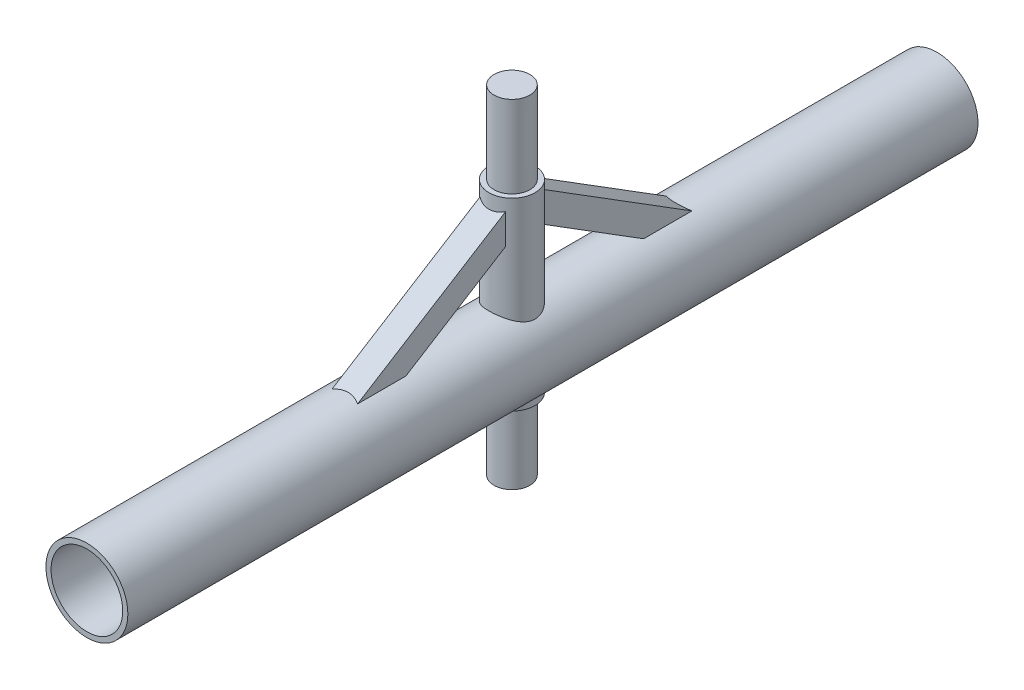
ISO-10303-21;
HEADER;
FILE_DESCRIPTION(('STEP AP214'),'2;1');
FILE_NAME('part.step','',(''),(''),'','','');
FILE_SCHEMA(('AUTOMOTIVE_DESIGN { 1 0 10303 214 1 1 1 1 }'));
ENDSEC;
DATA;
#1=APPLICATION_CONTEXT('core data for automotive mechanical design processes');
#2=APPLICATION_PROTOCOL_DEFINITION('international standard','automotive_design',2000,#1);
#3=PRODUCT_CONTEXT('',#1,'mechanical');
#4=PRODUCT('Part','Part','',(#3));
#5=PRODUCT_RELATED_PRODUCT_CATEGORY('part','',(#4));
#6=PRODUCT_DEFINITION_FORMATION('','',#4);
#7=PRODUCT_DEFINITION_CONTEXT('part definition',#1,'design');
#8=PRODUCT_DEFINITION('design','',#6,#7);
#9=PRODUCT_DEFINITION_SHAPE('','',#8);
#10=(LENGTH_UNIT() NAMED_UNIT(*) SI_UNIT(.MILLI.,.METRE.));
#11=(NAMED_UNIT(*) PLANE_ANGLE_UNIT() SI_UNIT($,.RADIAN.));
#12=(NAMED_UNIT(*) SI_UNIT($,.STERADIAN.) SOLID_ANGLE_UNIT());
#13=UNCERTAINTY_MEASURE_WITH_UNIT(LENGTH_MEASURE(1.E-05),#10,'distance_accuracy_value','');
#14=(GEOMETRIC_REPRESENTATION_CONTEXT(3) GLOBAL_UNCERTAINTY_ASSIGNED_CONTEXT((#13)) GLOBAL_UNIT_ASSIGNED_CONTEXT((#10,
#11,#12)) REPRESENTATION_CONTEXT('',''));
#15=CARTESIAN_POINT('',(0.,0.,0.));
#16=DIRECTION('',(0.,0.,1.));
#17=DIRECTION('',(1.,0.,0.));
#18=AXIS2_PLACEMENT_3D('',#15,#16,#17);
#19=CARTESIAN_POINT('',(12.5,140.,0.));
#20=DIRECTION('',(0.,-0.847998304005088,0.52999894000318));
#21=DIRECTION('',(0.,0.52999894000318,0.847998304005088));
#22=AXIS2_PLACEMENT_3D('',#19,#20,#21);
#23=PLANE('',#22);
#24=DIRECTION('',(0.,-0.52999894000318,-0.847998304005088));
#25=VECTOR('',#24,1.);
#26=CARTESIAN_POINT('',(12.5,140.,0.));
#27=LINE('',#26,#25);
#28=CARTESIAN_POINT('',(12.5,140.,0.));
#29=VERTEX_POINT('',#28);
#30=CARTESIAN_POINT('',(12.5,32.6917420765551,-171.693212677512));
#31=VERTEX_POINT('',#30);
#32=EDGE_CURVE('E115',#29,#31,#27,.T.);
#33=ORIENTED_EDGE('',*,*,#32,.T.);
#34=CARTESIAN_POINT('',(0.,0.,-224.));
#35=DIRECTION('',(0.,-0.847998304005088,0.52999894000318));
#36=DIRECTION('',(0.,-0.52999894000318,-0.847998304005088));
#37=AXIS2_PLACEMENT_3D('',#34,#35,#36);
#38=ELLIPSE('',#37,66.0378679243962,35.);
#39=CARTESIAN_POINT('',(-12.5,32.6917420765551,-171.693212677512));
#40=VERTEX_POINT('',#39);
#41=EDGE_CURVE('E125',#31,#40,#38,.T.);
#42=ORIENTED_EDGE('',*,*,#41,.T.);
#43=DIRECTION('',(0.,-0.52999894000318,-0.847998304005088));
#44=VECTOR('',#43,1.);
#45=CARTESIAN_POINT('',(-12.5,140.,0.));
#46=LINE('',#45,#44);
#47=CARTESIAN_POINT('',(-12.5,140.,0.));
#48=VERTEX_POINT('',#47);
#49=EDGE_CURVE('E111',#48,#40,#46,.T.);
#50=ORIENTED_EDGE('',*,*,#49,.F.);
#51=DIRECTION('',(-1.,0.,0.));
#52=VECTOR('',#51,1.);
#53=CARTESIAN_POINT('',(12.5,140.,0.));
#54=LINE('',#53,#52);
#55=EDGE_CURVE('E118',#29,#48,#54,.T.);
#56=ORIENTED_EDGE('',*,*,#55,.F.);
#57=EDGE_LOOP('',(#33,#42,#50,#56));
#58=FACE_BOUND('',#57,.T.);
#59=ADVANCED_FACE('F72',(#58),#23,.F.);
#60=CARTESIAN_POINT('',(12.5,118.800042399873,13.2499735000795));
#61=DIRECTION('',(0.,-0.847998304005088,0.52999894000318));
#62=DIRECTION('',(0.,0.52999894000318,0.847998304005088));
#63=AXIS2_PLACEMENT_3D('',#60,#61,#62);
#64=PLANE('',#63);
#65=CARTESIAN_POINT('',(0.,0.,-176.830094339717));
#66=DIRECTION('',(0.,-0.847998304005088,0.52999894000318));
#67=DIRECTION('',(0.,-0.52999894000318,-0.847998304005088));
#68=AXIS2_PLACEMENT_3D('',#65,#66,#67);
#69=ELLIPSE('',#68,66.0378679243962,35.);
#70=CARTESIAN_POINT('',(12.5,32.6917420765551,-124.523307017229));
#71=VERTEX_POINT('',#70);
#72=CARTESIAN_POINT('',(-12.5,32.6917420765551,-124.523307017229));
#73=VERTEX_POINT('',#72);
#74=EDGE_CURVE('E85',#71,#73,#69,.T.);
#75=ORIENTED_EDGE('',*,*,#74,.F.);
#76=DIRECTION('',(0.,-0.52999894000318,-0.847998304005088));
#77=VECTOR('',#76,1.);
#78=CARTESIAN_POINT('',(12.5,118.800042399873,13.2499735000795));
#79=LINE('',#78,#77);
#80=CARTESIAN_POINT('',(12.5,118.800042399873,13.2499735000795));
#81=VERTEX_POINT('',#80);
#82=EDGE_CURVE('E137',#81,#71,#79,.T.);
#83=ORIENTED_EDGE('',*,*,#82,.F.);
#84=DIRECTION('',(-1.,0.,0.));
#85=VECTOR('',#84,1.);
#86=CARTESIAN_POINT('',(12.5,118.800042399873,13.2499735000795));
#87=LINE('',#86,#85);
#88=CARTESIAN_POINT('',(-12.5,118.800042399873,13.2499735000795));
#89=VERTEX_POINT('',#88);
#90=EDGE_CURVE('E79',#81,#89,#87,.T.);
#91=ORIENTED_EDGE('',*,*,#90,.T.);
#92=DIRECTION('',(0.,-0.52999894000318,-0.847998304005088));
#93=VECTOR('',#92,1.);
#94=CARTESIAN_POINT('',(-12.5,118.800042399873,13.2499735000795));
#95=LINE('',#94,#93);
#96=EDGE_CURVE('E113',#89,#73,#95,.T.);
#97=ORIENTED_EDGE('',*,*,#96,.T.);
#98=EDGE_LOOP('',(#75,#83,#91,#97));
#99=FACE_BOUND('',#98,.T.);
#100=ADVANCED_FACE('F135',(#99),#64,.T.);
#101=CARTESIAN_POINT('',(12.5,140.,0.));
#102=DIRECTION('',(0.,0.52999894000318,0.847998304005088));
#103=DIRECTION('',(0.,0.847998304005088,-0.52999894000318));
#104=AXIS2_PLACEMENT_3D('',#101,#102,#103);
#105=PLANE('',#104);
#106=DIRECTION('',(0.,-0.847998304005088,0.52999894000318));
#107=VECTOR('',#106,1.);
#108=CARTESIAN_POINT('',(-12.5,140.,0.));
#109=LINE('',#108,#107);
#110=EDGE_CURVE('E107',#48,#89,#109,.T.);
#111=ORIENTED_EDGE('',*,*,#110,.T.);
#112=ORIENTED_EDGE('',*,*,#90,.F.);
#113=DIRECTION('',(0.,-0.847998304005088,0.52999894000318));
#114=VECTOR('',#113,1.);
#115=CARTESIAN_POINT('',(12.5,140.,0.));
#116=LINE('',#115,#114);
#117=EDGE_CURVE('E94',#29,#81,#116,.T.);
#118=ORIENTED_EDGE('',*,*,#117,.F.);
#119=ORIENTED_EDGE('',*,*,#55,.T.);
#120=EDGE_LOOP('',(#111,#112,#118,#119));
#121=FACE_BOUND('',#120,.T.);
#122=ADVANCED_FACE('F119',(#121),#105,.T.);
#123=CARTESIAN_POINT('',(12.5,0.,0.));
#124=DIRECTION('',(-1.,0.,0.));
#125=DIRECTION('',(0.,0.,-1.));
#126=AXIS2_PLACEMENT_3D('',#123,#124,#125);
#127=PLANE('',#126);
#128=ORIENTED_EDGE('',*,*,#82,.T.);
#129=DIRECTION('',(0.,0.,-1.));
#130=VECTOR('',#129,1.);
#131=CARTESIAN_POINT('',(12.5,32.691742076555,431.));
#132=LINE('',#131,#130);
#133=EDGE_CURVE('E126',#71,#31,#132,.T.);
#134=ORIENTED_EDGE('',*,*,#133,.T.);
#135=ORIENTED_EDGE('',*,*,#32,.F.);
#136=ORIENTED_EDGE('',*,*,#117,.T.);
#137=EDGE_LOOP('',(#128,#134,#135,#136));
#138=FACE_BOUND('',#137,.T.);
#139=ADVANCED_FACE('F143',(#138),#127,.F.);
#140=CARTESIAN_POINT('',(-12.5,0.,0.));
#141=DIRECTION('',(-1.,0.,0.));
#142=DIRECTION('',(0.,0.,-1.));
#143=AXIS2_PLACEMENT_3D('',#140,#141,#142);
#144=PLANE('',#143);
#145=DIRECTION('',(0.,0.,-1.));
#146=VECTOR('',#145,1.);
#147=CARTESIAN_POINT('',(-12.5,32.691742076555,431.));
#148=LINE('',#147,#146);
#149=EDGE_CURVE('E13',#73,#40,#148,.T.);
#150=ORIENTED_EDGE('',*,*,#149,.F.);
#151=ORIENTED_EDGE('',*,*,#96,.F.);
#152=ORIENTED_EDGE('',*,*,#110,.F.);
#153=ORIENTED_EDGE('',*,*,#49,.T.);
#154=EDGE_LOOP('',(#150,#151,#152,#153));
#155=FACE_BOUND('',#154,.T.);
#156=ADVANCED_FACE('F108',(#155),#144,.T.);
#157=CARTESIAN_POINT('',(0.,0.,431.));
#158=DIRECTION('',(0.,0.,-1.));
#159=DIRECTION('',(-1.,0.,0.));
#160=AXIS2_PLACEMENT_3D('',#157,#158,#159);
#161=CYLINDRICAL_SURFACE('',#160,35.);
#162=ORIENTED_EDGE('',*,*,#74,.T.);
#163=ORIENTED_EDGE('',*,*,#149,.T.);
#164=ORIENTED_EDGE('',*,*,#41,.F.);
#165=ORIENTED_EDGE('',*,*,#133,.F.);
#166=EDGE_LOOP('',(#162,#163,#164,#165));
#167=FACE_BOUND('',#166,.T.);
#168=ADVANCED_FACE('F144',(#167),#161,.F.);
#169=CLOSED_SHELL('',(#59,#100,#122,#139,#156,#168));
#170=MANIFOLD_SOLID_BREP('B2',#169);
#171=CARTESIAN_POINT('',(12.5,140.,0.));
#172=DIRECTION('',(0.,-0.847998304005088,-0.52999894000318));
#173=DIRECTION('',(0.,0.52999894000318,-0.847998304005088));
#174=AXIS2_PLACEMENT_3D('',#171,#172,#173);
#175=PLANE('',#174);
#176=DIRECTION('',(0.,-0.52999894000318,0.847998304005088));
#177=VECTOR('',#176,1.);
#178=CARTESIAN_POINT('',(-12.5,140.,0.));
#179=LINE('',#178,#177);
#180=CARTESIAN_POINT('',(-12.5,140.,0.));
#181=VERTEX_POINT('',#180);
#182=CARTESIAN_POINT('',(-12.5,32.6917420765549,171.693212677512));
#183=VERTEX_POINT('',#182);
#184=EDGE_CURVE('E243',#181,#183,#179,.T.);
#185=ORIENTED_EDGE('',*,*,#184,.T.);
#186=CARTESIAN_POINT('',(0.,0.,224.));
#187=DIRECTION('',(0.,-0.847998304005088,-0.52999894000318));
#188=DIRECTION('',(0.,0.52999894000318,-0.847998304005088));
#189=AXIS2_PLACEMENT_3D('',#186,#187,#188);
#190=ELLIPSE('',#189,66.0378679243962,35.);
#191=CARTESIAN_POINT('',(12.5,32.6917420765551,171.693212677512));
#192=VERTEX_POINT('',#191);
#193=EDGE_CURVE('E221',#183,#192,#190,.T.);
#194=ORIENTED_EDGE('',*,*,#193,.T.);
#195=DIRECTION('',(0.,-0.52999894000318,0.847998304005088));
#196=VECTOR('',#195,1.);
#197=CARTESIAN_POINT('',(12.5,140.,0.));
#198=LINE('',#197,#196);
#199=CARTESIAN_POINT('',(12.5,140.,0.));
#200=VERTEX_POINT('',#199);
#201=EDGE_CURVE('E245',#200,#192,#198,.T.);
#202=ORIENTED_EDGE('',*,*,#201,.F.);
#203=DIRECTION('',(-1.,0.,0.));
#204=VECTOR('',#203,1.);
#205=CARTESIAN_POINT('',(12.5,140.,0.));
#206=LINE('',#205,#204);
#207=EDGE_CURVE('E230',#200,#181,#206,.T.);
#208=ORIENTED_EDGE('',*,*,#207,.T.);
#209=EDGE_LOOP('',(#185,#194,#202,#208));
#210=FACE_BOUND('',#209,.T.);
#211=ADVANCED_FACE('F208',(#210),#175,.F.);
#212=CARTESIAN_POINT('',(12.5,118.800042399873,-13.2499735000795));
#213=DIRECTION('',(0.,-0.847998304005088,-0.52999894000318));
#214=DIRECTION('',(0.,0.52999894000318,-0.847998304005088));
#215=AXIS2_PLACEMENT_3D('',#212,#213,#214);
#216=PLANE('',#215);
#217=CARTESIAN_POINT('',(0.,0.,176.830094339717));
#218=DIRECTION('',(0.,-0.847998304005088,-0.52999894000318));
#219=DIRECTION('',(0.,0.52999894000318,-0.847998304005088));
#220=AXIS2_PLACEMENT_3D('',#217,#218,#219);
#221=ELLIPSE('',#220,66.0378679243962,35.);
#222=CARTESIAN_POINT('',(-12.5,32.6917420765549,124.523307017229));
#223=VERTEX_POINT('',#222);
#224=CARTESIAN_POINT('',(12.5,32.6917420765551,124.523307017229));
#225=VERTEX_POINT('',#224);
#226=EDGE_CURVE('E270',#223,#225,#221,.T.);
#227=ORIENTED_EDGE('',*,*,#226,.F.);
#228=DIRECTION('',(0.,-0.52999894000318,0.847998304005088));
#229=VECTOR('',#228,1.);
#230=CARTESIAN_POINT('',(-12.5,118.800042399873,-13.2499735000795));
#231=LINE('',#230,#229);
#232=CARTESIAN_POINT('',(-12.5,118.800042399873,-13.2499735000795));
#233=VERTEX_POINT('',#232);
#234=EDGE_CURVE('E254',#233,#223,#231,.T.);
#235=ORIENTED_EDGE('',*,*,#234,.F.);
#236=DIRECTION('',(-1.,0.,0.));
#237=VECTOR('',#236,1.);
#238=CARTESIAN_POINT('',(12.5,118.800042399873,-13.2499735000795));
#239=LINE('',#238,#237);
#240=CARTESIAN_POINT('',(12.5,118.800042399873,-13.2499735000795));
#241=VERTEX_POINT('',#240);
#242=EDGE_CURVE('E215',#241,#233,#239,.T.);
#243=ORIENTED_EDGE('',*,*,#242,.F.);
#244=DIRECTION('',(0.,-0.52999894000318,0.847998304005088));
#245=VECTOR('',#244,1.);
#246=CARTESIAN_POINT('',(12.5,118.800042399873,-13.2499735000795));
#247=LINE('',#246,#245);
#248=EDGE_CURVE('E260',#241,#225,#247,.T.);
#249=ORIENTED_EDGE('',*,*,#248,.T.);
#250=EDGE_LOOP('',(#227,#235,#243,#249));
#251=FACE_BOUND('',#250,.T.);
#252=ADVANCED_FACE('F281',(#251),#216,.T.);
#253=CARTESIAN_POINT('',(12.5,140.,0.));
#254=DIRECTION('',(0.,0.52999894000318,-0.847998304005088));
#255=DIRECTION('',(0.,0.847998304005088,0.52999894000318));
#256=AXIS2_PLACEMENT_3D('',#253,#254,#255);
#257=PLANE('',#256);
#258=DIRECTION('',(0.,-0.847998304005088,-0.52999894000318));
#259=VECTOR('',#258,1.);
#260=CARTESIAN_POINT('',(-12.5,140.,0.));
#261=LINE('',#260,#259);
#262=EDGE_CURVE('E253',#181,#233,#261,.T.);
#263=ORIENTED_EDGE('',*,*,#262,.F.);
#264=ORIENTED_EDGE('',*,*,#207,.F.);
#265=DIRECTION('',(0.,-0.847998304005088,-0.52999894000318));
#266=VECTOR('',#265,1.);
#267=CARTESIAN_POINT('',(12.5,140.,0.));
#268=LINE('',#267,#266);
#269=EDGE_CURVE('E247',#200,#241,#268,.T.);
#270=ORIENTED_EDGE('',*,*,#269,.T.);
#271=ORIENTED_EDGE('',*,*,#242,.T.);
#272=EDGE_LOOP('',(#263,#264,#270,#271));
#273=FACE_BOUND('',#272,.T.);
#274=ADVANCED_FACE('F257',(#273),#257,.T.);
#275=CARTESIAN_POINT('',(12.5,0.,0.));
#276=DIRECTION('',(-1.,0.,0.));
#277=DIRECTION('',(0.,0.,1.));
#278=AXIS2_PLACEMENT_3D('',#275,#276,#277);
#279=PLANE('',#278);
#280=ORIENTED_EDGE('',*,*,#201,.T.);
#281=DIRECTION('',(0.,0.,-1.));
#282=VECTOR('',#281,1.);
#283=CARTESIAN_POINT('',(12.5,32.691742076555,431.));
#284=LINE('',#283,#282);
#285=EDGE_CURVE('E255',#192,#225,#284,.T.);
#286=ORIENTED_EDGE('',*,*,#285,.T.);
#287=ORIENTED_EDGE('',*,*,#248,.F.);
#288=ORIENTED_EDGE('',*,*,#269,.F.);
#289=EDGE_LOOP('',(#280,#286,#287,#288));
#290=FACE_BOUND('',#289,.T.);
#291=ADVANCED_FACE('F280',(#290),#279,.F.);
#292=CARTESIAN_POINT('',(-12.5,0.,0.));
#293=DIRECTION('',(-1.,0.,0.));
#294=DIRECTION('',(0.,0.,1.));
#295=AXIS2_PLACEMENT_3D('',#292,#293,#294);
#296=PLANE('',#295);
#297=DIRECTION('',(0.,0.,-1.));
#298=VECTOR('',#297,1.);
#299=CARTESIAN_POINT('',(-12.5,32.691742076555,431.));
#300=LINE('',#299,#298);
#301=EDGE_CURVE('E70',#183,#223,#300,.T.);
#302=ORIENTED_EDGE('',*,*,#301,.F.);
#303=ORIENTED_EDGE('',*,*,#184,.F.);
#304=ORIENTED_EDGE('',*,*,#262,.T.);
#305=ORIENTED_EDGE('',*,*,#234,.T.);
#306=EDGE_LOOP('',(#302,#303,#304,#305));
#307=FACE_BOUND('',#306,.T.);
#308=ADVANCED_FACE('F251',(#307),#296,.T.);
#309=CARTESIAN_POINT('',(0.,0.,431.));
#310=DIRECTION('',(0.,0.,-1.));
#311=DIRECTION('',(-1.,0.,0.));
#312=AXIS2_PLACEMENT_3D('',#309,#310,#311);
#313=CYLINDRICAL_SURFACE('',#312,35.);
#314=ORIENTED_EDGE('',*,*,#193,.F.);
#315=ORIENTED_EDGE('',*,*,#301,.T.);
#316=ORIENTED_EDGE('',*,*,#226,.T.);
#317=ORIENTED_EDGE('',*,*,#285,.F.);
#318=EDGE_LOOP('',(#314,#315,#316,#317));
#319=FACE_BOUND('',#318,.T.);
#320=ADVANCED_FACE('F274',(#319),#313,.F.);
#321=CLOSED_SHELL('',(#211,#252,#274,#291,#308,#320));
#322=MANIFOLD_SOLID_BREP('B7',#321);
#323=CARTESIAN_POINT('',(0.,0.,415.));
#324=DIRECTION('',(0.,0.,1.));
#325=DIRECTION('',(1.,0.,0.));
#326=AXIS2_PLACEMENT_3D('',#323,#324,#325);
#327=PLANE('',#326);
#328=CARTESIAN_POINT('',(0.,0.,415.));
#329=DIRECTION('',(0.,0.,1.));
#330=DIRECTION('',(1.,0.,0.));
#331=AXIS2_PLACEMENT_3D('',#328,#329,#330);
#332=CIRCLE('',#331,40.);
#333=CARTESIAN_POINT('',(40.,0.,415.));
#334=VERTEX_POINT('',#333);
#335=EDGE_CURVE('E206',#334,#334,#332,.T.);
#336=ORIENTED_EDGE('',*,*,#335,.T.);
#337=EDGE_LOOP('',(#336));
#338=FACE_BOUND('',#337,.T.);
#339=CARTESIAN_POINT('',(0.,0.,415.));
#340=DIRECTION('',(0.,0.,1.));
#341=DIRECTION('',(1.,0.,0.));
#342=AXIS2_PLACEMENT_3D('',#339,#340,#341);
#343=CIRCLE('',#342,35.);
#344=CARTESIAN_POINT('',(35.,0.,415.));
#345=VERTEX_POINT('',#344);
#346=EDGE_CURVE('E372',#345,#345,#343,.T.);
#347=ORIENTED_EDGE('',*,*,#346,.F.);
#348=EDGE_LOOP('',(#347));
#349=FACE_BOUND('',#348,.T.);
#350=ADVANCED_FACE('F335',(#338,#349),#327,.T.);
#351=CARTESIAN_POINT('',(0.,0.,-415.));
#352=DIRECTION('',(0.,0.,1.));
#353=DIRECTION('',(1.,0.,0.));
#354=AXIS2_PLACEMENT_3D('',#351,#352,#353);
#355=PLANE('',#354);
#356=CARTESIAN_POINT('',(0.,0.,-415.));
#357=DIRECTION('',(0.,0.,1.));
#358=DIRECTION('',(1.,0.,0.));
#359=AXIS2_PLACEMENT_3D('',#356,#357,#358);
#360=CIRCLE('',#359,40.);
#361=CARTESIAN_POINT('',(40.,0.,-415.));
#362=VERTEX_POINT('',#361);
#363=EDGE_CURVE('E340',#362,#362,#360,.T.);
#364=ORIENTED_EDGE('',*,*,#363,.F.);
#365=EDGE_LOOP('',(#364));
#366=FACE_BOUND('',#365,.T.);
#367=CARTESIAN_POINT('',(0.,0.,-415.));
#368=DIRECTION('',(0.,0.,1.));
#369=DIRECTION('',(1.,0.,0.));
#370=AXIS2_PLACEMENT_3D('',#367,#368,#369);
#371=CIRCLE('',#370,35.);
#372=CARTESIAN_POINT('',(35.,0.,-415.));
#373=VERTEX_POINT('',#372);
#374=EDGE_CURVE('E370',#373,#373,#371,.T.);
#375=ORIENTED_EDGE('',*,*,#374,.T.);
#376=EDGE_LOOP('',(#375));
#377=FACE_BOUND('',#376,.T.);
#378=ADVANCED_FACE('F395',(#366,#377),#355,.F.);
#379=CARTESIAN_POINT('',(0.,0.,415.));
#380=DIRECTION('',(0.,0.,-1.));
#381=DIRECTION('',(-1.,0.,0.));
#382=AXIS2_PLACEMENT_3D('',#379,#380,#381);
#383=CYLINDRICAL_SURFACE('',#382,40.);
#384=CARTESIAN_POINT('',(0.,40.,22.5));
#385=CARTESIAN_POINT('',(-0.582842708004399,40.0000028747453,22.5000032616442));
#386=CARTESIAN_POINT('',(-1.16564520092616,39.9872350148417,22.4773295988438));
#387=CARTESIAN_POINT('',(-2.32659981126642,39.9365050427239,22.3869571422411));
#388=CARTESIAN_POINT('',(-2.90475234131067,39.8985451915144,22.3192623891223));
#389=CARTESIAN_POINT('',(-4.05204204985224,39.798399617706,22.1397413317104));
#390=CARTESIAN_POINT('',(-4.62117868017059,39.7362124278905,22.027912354627));
#391=CARTESIAN_POINT('',(-5.74635607353228,39.5891569260193,21.7615181410175));
#392=CARTESIAN_POINT('',(-6.30239641185826,39.5042878794819,21.6069515205597));
#393=CARTESIAN_POINT('',(-7.39567880800235,39.3142552389115,21.257517911812));
#394=CARTESIAN_POINT('',(-7.93298402016726,39.2091696308424,21.0628055861302));
#395=CARTESIAN_POINT('',(-8.98792861881766,38.9808726729156,20.6347089136993));
#396=CARTESIAN_POINT('',(-9.5055682007765,38.8576615032827,20.4013249514642));
#397=CARTESIAN_POINT('',(-10.5186834156493,38.5957396316075,19.8979225259563));
#398=CARTESIAN_POINT('',(-11.0141561118093,38.4570268843219,19.6278992275626));
#399=CARTESIAN_POINT('',(-11.9807434448446,38.1669549646015,19.0532925118838));
#400=CARTESIAN_POINT('',(-12.4518569374973,38.0155951989715,18.7487074732761));
#401=CARTESIAN_POINT('',(-13.4002873733342,37.6921837900244,18.0842695197957));
#402=CARTESIAN_POINT('',(-13.8756936721032,37.5194257363197,17.7220327712706));
#403=CARTESIAN_POINT('',(-14.794656096327,37.1666576002672,16.9624168302446));
#404=CARTESIAN_POINT('',(-15.2382109936693,36.9866472387053,16.5650362840012));
#405=CARTESIAN_POINT('',(-16.092205275423,36.623168795607,15.7367441117663));
#406=CARTESIAN_POINT('',(-16.5026118832935,36.4396975077673,15.3058001058968));
#407=CARTESIAN_POINT('',(-17.2882037348819,36.073616992836,14.4125575180027));
#408=CARTESIAN_POINT('',(-17.6633872440418,35.8910078086188,13.9502573937779));
#409=CARTESIAN_POINT('',(-18.4141973362719,35.5121408242704,12.9460578826098));
#410=CARTESIAN_POINT('',(-18.7857586740667,35.3164554271611,12.4008919729551));
#411=CARTESIAN_POINT('',(-19.4813208398476,34.9375880544138,11.2767478054505));
#412=CARTESIAN_POINT('',(-19.8053152339639,34.754407771998,10.6977649883278));
#413=CARTESIAN_POINT('',(-20.4024712706217,34.4072427610336,9.50950858111642));
#414=CARTESIAN_POINT('',(-20.6756932603201,34.2432353311436,8.90027205623779));
#415=CARTESIAN_POINT('',(-21.1685574077533,33.940770755214,7.65444588842905));
#416=CARTESIAN_POINT('',(-21.3882164148005,33.802305577692,7.01786492154682));
#417=CARTESIAN_POINT('',(-21.7296056132037,33.5835671119156,5.86136117498093));
#418=CARTESIAN_POINT('',(-21.8622369046886,33.4971831758974,5.34578929180124));
#419=CARTESIAN_POINT('',(-22.0910629081592,33.3467203273417,4.30343013769548));
#420=CARTESIAN_POINT('',(-22.1872628603243,33.2826382070824,3.77664449124675));
#421=CARTESIAN_POINT('',(-22.3419453368724,33.1790019869129,2.71562919059567));
#422=CARTESIAN_POINT('',(-22.4004606838209,33.1394265433182,2.18140642948987));
#423=CARTESIAN_POINT('',(-22.4790931833452,33.0861398549894,1.10882831644106));
#424=CARTESIAN_POINT('',(-22.4992095468679,33.0724291417446,0.570472879804749));
#425=CARTESIAN_POINT('',(-22.5007456435318,33.0713841204579,-0.506964754478015));
#426=CARTESIAN_POINT('',(-22.4821189548791,33.0840814544473,-1.04604704963445));
#427=CARTESIAN_POINT('',(-22.4063500474121,33.1354424845277,-2.12023636008031));
#428=CARTESIAN_POINT('',(-22.3492076894862,33.1741062744047,-2.65534336100462));
#429=CARTESIAN_POINT('',(-22.1971680751838,33.2760284597723,-3.71807066599507));
#430=CARTESIAN_POINT('',(-22.1022495749259,33.3393006936698,-4.24568658415381));
#431=CARTESIAN_POINT('',(-21.8758721303611,33.4882745376466,-5.28976365573693));
#432=CARTESIAN_POINT('',(-21.7444123023207,33.5739766901793,-5.80622453905684));
#433=CARTESIAN_POINT('',(-21.4466995150655,33.7649263321605,-6.82420937216611));
#434=CARTESIAN_POINT('',(-21.2805106914385,33.8701377531723,-7.3257589358119));
#435=CARTESIAN_POINT('',(-20.9146901170169,34.0972443409954,-8.31281608907455));
#436=CARTESIAN_POINT('',(-20.7150447391058,34.2191463022773,-8.79831704510393));
#437=CARTESIAN_POINT('',(-20.2839059870141,34.4764579192127,-9.75123926652381));
#438=CARTESIAN_POINT('',(-20.052411789127,34.6118679242,-10.2186600639062));
#439=CARTESIAN_POINT('',(-19.5590265398915,34.8930524304818,-11.1339499291878));
#440=CARTESIAN_POINT('',(-19.2971321676898,35.0388280634215,-11.5818168536939));
#441=CARTESIAN_POINT('',(-18.7012500107675,35.3609257042423,-12.5248095074577));
#442=CARTESIAN_POINT('',(-18.362385601054,35.5384708435214,-13.0164423914936));
#443=CARTESIAN_POINT('',(-17.6477151227213,35.89872287142,-13.970084726176));
#444=CARTESIAN_POINT('',(-17.2719060582923,36.0814301777777,-14.4320917694615));
#445=CARTESIAN_POINT('',(-16.4847539342782,36.447790872857,-15.3250570573738));
#446=CARTESIAN_POINT('',(-16.0733843834685,36.6314448693689,-15.7559917082119));
#447=CARTESIAN_POINT('',(-15.2169892280442,36.995401587998,-16.5845790853625));
#448=CARTESIAN_POINT('',(-14.7719621880343,37.175704166778,-16.9822303907103));
#449=CARTESIAN_POINT('',(-13.8006050868513,37.5478608254627,-17.7828737659942));
#450=CARTESIAN_POINT('',(-13.2706695120362,37.7388889748402,-18.1818915017718));
#451=CARTESIAN_POINT('',(-12.174159121949,38.106748314231,-18.9336132878125));
#452=CARTESIAN_POINT('',(-11.6075811559579,38.2835782804665,-19.2863133474979));
#453=CARTESIAN_POINT('',(-10.4412055867492,38.6179886952564,-19.9418780897963));
#454=CARTESIAN_POINT('',(-9.84142412334843,38.7755783789183,-20.2447667057292));
#455=CARTESIAN_POINT('',(-8.61231098762186,39.0669528010283,-20.7974025899126));
#456=CARTESIAN_POINT('',(-7.98298295790614,39.2007404641885,-21.0471563879301));
#457=CARTESIAN_POINT('',(-6.74463104802714,39.4319466125262,-21.4745986621966));
#458=CARTESIAN_POINT('',(-6.13728234023035,39.5312586885121,-21.6561148759567));
#459=CARTESIAN_POINT('',(-4.9057934380301,39.7028910031878,-21.9678519010774));
#460=CARTESIAN_POINT('',(-4.28165388410641,39.7752122698701,-22.0980746660497));
#461=CARTESIAN_POINT('',(-3.02240505507508,39.8906569794945,-22.3051991237483));
#462=CARTESIAN_POINT('',(-2.38730464262449,39.9338029738052,-22.3821420008974));
#463=CARTESIAN_POINT('',(-1.11154805783345,39.9896480891537,-22.4816299070194));
#464=CARTESIAN_POINT('',(-0.470892470868689,40.0023503799851,-22.5041805992999));
#465=CARTESIAN_POINT('',(0.734891137641707,39.9972486929139,-22.4951068807173));
#466=CARTESIAN_POINT('',(1.30009043291871,39.9828384065366,-22.4695093120004));
#467=CARTESIAN_POINT('',(2.42582295046457,39.930349300341,-22.3759761851093));
#468=CARTESIAN_POINT('',(2.98635660741586,39.8922727110246,-22.3080446168284));
#469=CARTESIAN_POINT('',(4.09875709596571,39.7933669230592,-22.1306903318865));
#470=CARTESIAN_POINT('',(4.65062392829828,39.7325377263372,-22.0212676187395));
#471=CARTESIAN_POINT('',(5.74200838210678,39.5895474307202,-21.7622132120761));
#472=CARTESIAN_POINT('',(6.28152561431637,39.5073856604152,-21.6125802529988));
#473=CARTESIAN_POINT('',(7.341408120721,39.3241796438909,-21.2758294792172));
#474=CARTESIAN_POINT('',(7.86187568783914,39.2232625933147,-21.0889635911317));
#475=CARTESIAN_POINT('',(8.88454995875952,39.0043362964773,-20.6789335077446));
#476=CARTESIAN_POINT('',(9.38675696995999,38.8863273381081,-20.455769923825));
#477=CARTESIAN_POINT('',(10.370624284151,38.6355785086386,-19.9749842864997));
#478=CARTESIAN_POINT('',(10.8522819537049,38.5028367573066,-19.7173578340033));
#479=CARTESIAN_POINT('',(11.7930454249405,38.225183860513,-19.1695184602571));
#480=CARTESIAN_POINT('',(12.2521490314041,38.0802715341771,-18.8793023760107));
#481=CARTESIAN_POINT('',(13.1924543768361,37.7654569920647,-18.2363992046701));
#482=CARTESIAN_POINT('',(13.6710168824329,37.594521235013,-17.8803549654531));
#483=CARTESIAN_POINT('',(14.5967230630132,37.2448726587364,-17.1329978929119));
#484=CARTESIAN_POINT('',(15.0438648590613,37.0661593754542,-16.7416829536144));
#485=CARTESIAN_POINT('',(15.9054858281653,36.7046864395835,-15.9253905671844));
#486=CARTESIAN_POINT('',(16.3199303364447,36.5219227488839,-15.5003783269997));
#487=CARTESIAN_POINT('',(17.1140229353742,36.1566213244706,-14.618897371812));
#488=CARTESIAN_POINT('',(17.4936695166261,35.9740836008969,-14.162427293794));
#489=CARTESIAN_POINT('',(18.2546867308676,35.5944628299379,-13.1699519560009));
#490=CARTESIAN_POINT('',(18.6320057696805,35.3978793641979,-12.6306380600478));
#491=CARTESIAN_POINT('',(19.3396246141173,35.0162902753691,-11.5179703056099));
#492=CARTESIAN_POINT('',(19.6699179985173,34.8312862353482,-10.9446118135467));
#493=CARTESIAN_POINT('',(20.2802888210826,34.4794703274144,-9.76724410827358));
#494=CARTESIAN_POINT('',(20.5604224951556,34.3126381696075,-9.16327020673268));
#495=CARTESIAN_POINT('',(21.0677590453888,34.0034982959611,-7.92750221028706));
#496=CARTESIAN_POINT('',(21.2949780026454,33.8611831326922,-7.29571663709827));
#497=CARTESIAN_POINT('',(21.6512851126343,33.6341573323385,-6.14446934407055));
#498=CARTESIAN_POINT('',(21.7909625019975,33.5436277825332,-5.62941147743464));
#499=CARTESIAN_POINT('',(22.0338698578887,33.38457306447,-4.58744071209731));
#500=CARTESIAN_POINT('',(22.137104934085,33.316044811477,-4.06052948641439));
#501=CARTESIAN_POINT('',(22.3057675260576,33.2033590300313,-2.99858432092782));
#502=CARTESIAN_POINT('',(22.3712291338128,33.1591795275354,-2.46355815425026));
#503=CARTESIAN_POINT('',(22.4635839410865,33.0966846403113,-1.38865374777624));
#504=CARTESIAN_POINT('',(22.4904764451699,33.0783697219444,-0.848775420667643));
#505=CARTESIAN_POINT('',(22.5053049645616,33.0682829170737,0.23261307552891));
#506=CARTESIAN_POINT('',(22.4931799375531,33.0765526217762,0.774124476151855));
#507=CARTESIAN_POINT('',(22.4300206355747,33.1194144030121,1.85381202741109));
#508=CARTESIAN_POINT('',(22.378986220655,33.1540065742223,2.39198816604406));
#509=CARTESIAN_POINT('',(22.2387016174045,33.2482669707807,3.46138112903372));
#510=CARTESIAN_POINT('',(22.1494307135042,33.3079487887445,3.99259401986397));
#511=CARTESIAN_POINT('',(21.9338416953683,33.4503098295933,5.04428009275164));
#512=CARTESIAN_POINT('',(21.8075228167667,33.5329895269639,5.56475305298794));
#513=CARTESIAN_POINT('',(21.5206502474681,33.7178054306713,6.58717860674981));
#514=CARTESIAN_POINT('',(21.3604280955623,33.8197522609197,7.08925896068201));
#515=CARTESIAN_POINT('',(21.0065351490843,34.0406959061054,8.07782465811443));
#516=CARTESIAN_POINT('',(20.812850766109,34.1596996441845,8.56430357062971));
#517=CARTESIAN_POINT('',(20.3936202014752,34.4116263630953,9.51957738447175));
#518=CARTESIAN_POINT('',(20.1680735290279,34.5445495583264,9.9883720132588));
#519=CARTESIAN_POINT('',(19.6865698566683,34.8212013610111,10.9067805492393));
#520=CARTESIAN_POINT('',(19.4306094852802,34.9649311657694,11.3563923224172));
#521=CARTESIAN_POINT('',(18.8483766515658,35.2826411400952,12.302124193347));
#522=CARTESIAN_POINT('',(18.5173337964633,35.4578927113437,12.7948861134352));
#523=CARTESIAN_POINT('',(17.8185077643356,35.8141678598962,13.7514247051597));
#524=CARTESIAN_POINT('',(17.4507217042829,35.9951918893718,14.2151990976632));
#525=CARTESIAN_POINT('',(16.6798128911534,36.3588446828272,15.1123751010795));
#526=CARTESIAN_POINT('',(16.276664065139,36.5414745399896,15.5457538704086));
#527=CARTESIAN_POINT('',(15.4368701353822,36.9040954320493,16.3799684944036));
#528=CARTESIAN_POINT('',(15.0002234595867,37.0840863426283,16.7808028199406));
#529=CARTESIAN_POINT('',(14.0438865162204,37.4574636046044,17.5913393469233));
#530=CARTESIAN_POINT('',(13.5203877669238,37.6500655065729,17.9969258731484));
#531=CARTESIAN_POINT('',(12.4363902170088,38.021895461094,18.7623678726819));
#532=CARTESIAN_POINT('',(11.8758882841386,38.201122378736,19.1222194670508));
#533=CARTESIAN_POINT('',(10.7211231913536,38.5411415475915,19.792752877163));
#534=CARTESIAN_POINT('',(10.1268725068549,38.701940545304,20.1034527034174));
#535=CARTESIAN_POINT('',(8.90819118933411,39.0004812323622,20.672353237221));
#536=CARTESIAN_POINT('',(8.28376357728893,39.1382252235811,20.9305591864514));
#537=CARTESIAN_POINT('',(7.04132339569299,39.3801978902147,21.3795207547904));
#538=CARTESIAN_POINT('',(6.42455994079949,39.4857610624682,21.5730098946964));
#539=CARTESIAN_POINT('',(5.1727556732637,39.6691646879598,21.9068966203075));
#540=CARTESIAN_POINT('',(4.53771534324535,39.7470058725072,22.0472956065436));
#541=CARTESIAN_POINT('',(3.2554487409985,39.8725055166326,22.2727517065634));
#542=CARTESIAN_POINT('',(2.60823260053873,39.9201880192659,22.3578529062426));
#543=CARTESIAN_POINT('',(1.30732698747563,39.9839319818189,22.4714722408014));
#544=CARTESIAN_POINT('',(0.653638204770673,39.9999967760712,22.4999963421774));
#545=CARTESIAN_POINT('',(0.,40.,22.5));
#546=B_SPLINE_CURVE_WITH_KNOTS('',3,(#384,#385,#386,#387,#388,#389,#390,#391,#392,#393,#394,
#395,#396,#397,#398,#399,#400,#401,#402,#403,#404,#405,#406,#407,#408,#409,#410,#411,#412,#413,
#414,#415,#416,#417,#418,#419,#420,#421,#422,#423,#424,#425,#426,#427,#428,#429,#430,#431,#432,
#433,#434,#435,#436,#437,#438,#439,#440,#441,#442,#443,#444,#445,#446,#447,#448,#449,#450,#451,
#452,#453,#454,#455,#456,#457,#458,#459,#460,#461,#462,#463,#464,#465,#466,#467,#468,#469,#470,
#471,#472,#473,#474,#475,#476,#477,#478,#479,#480,#481,#482,#483,#484,#485,#486,#487,#488,#489,
#490,#491,#492,#493,#494,#495,#496,#497,#498,#499,#500,#501,#502,#503,#504,#505,#506,#507,#508,
#509,#510,#511,#512,#513,#514,#515,#516,#517,#518,#519,#520,#521,#522,#523,#524,#525,#526,#527,
#528,#529,#530,#531,#532,#533,#534,#535,#536,#537,#538,#539,#540,#541,#542,#543,#544,#545),
.UNSPECIFIED.,.T.,.F.,(4,2,2,2,2,2,2,2,2,2,2,2,2,2,2,2,2,2,2,2,2,2,2,2,2,2,2,2,2,2,2,2,2,2,2,2,
2,2,2,2,2,2,2,2,2,2,2,2,2,2,2,2,2,2,2,2,2,2,2,2,2,2,2,2,2,2,2,2,2,2,2,2,2,2,2,2,2,2,2,2,4),(0.,
1.74788258980461,3.49560832673239,5.24343992303279,6.99132812429678,8.7326043047442,
10.4738631726423,12.215352050169,13.9569226563135,15.8214599492725,17.6860690956854,
19.5524999267625,21.4190226218886,23.4809425187509,25.5431410529448,27.6028725948799,
29.6619553685929,31.2782507852991,32.8943136303252,34.5089670052715,36.1236535590558,
37.7402759392693,39.3569041584619,40.9744427960917,42.5920205564793,44.2066370530324,
45.8219128011049,47.4372303329296,49.0527244851114,50.9196394644646,52.7867059553951,
54.6551755289719,56.5237248323999,58.5920468631398,60.6605469769155,62.7280502989462,
64.7952993974101,66.7174528259369,68.6395330383994,70.5601258529216,72.4805186869197,
74.1763413530968,75.8720042156007,77.5676669344917,79.2633830282278,80.9479929903391,
82.6325745805822,84.3173714086069,86.002331896659,87.8618787289785,89.7215366663631,
91.5831403842285,93.4448248130155,95.5031049763688,97.5616659232247,99.6179042898394,
101.673516935531,103.295709124258,104.917673770918,106.53817223441,108.158699916558,
109.781764120775,111.404834162877,113.028784658048,114.652768660579,116.261550655175,
117.870987489041,119.48044911647,121.09008932566,122.945100407139,124.800257155129,
126.656793394309,128.51341681404,130.579827131609,132.646412591869,134.71223903759,
136.777859102514,138.739874375879,140.701837887207,142.662235307132,144.622425976861),.UNSPECIFIED.);
#547=CARTESIAN_POINT('',(0.,40.,22.5));
#548=VERTEX_POINT('',#547);
#549=EDGE_CURVE('E362',#548,#548,#546,.T.);
#550=ORIENTED_EDGE('',*,*,#549,.T.);
#551=EDGE_LOOP('',(#550));
#552=FACE_BOUND('',#551,.T.);
#553=CARTESIAN_POINT('',(0.,-40.,22.5));
#554=CARTESIAN_POINT('',(0.582842708004399,-40.0000028747453,22.5000032616442));
#555=CARTESIAN_POINT('',(1.16564520092616,-39.9872350148417,22.4773295988438));
#556=CARTESIAN_POINT('',(2.32659981126642,-39.9365050427239,22.3869571422411));
#557=CARTESIAN_POINT('',(2.90475234131067,-39.8985451915144,22.3192623891223));
#558=CARTESIAN_POINT('',(4.05204204985224,-39.798399617706,22.1397413317104));
#559=CARTESIAN_POINT('',(4.62117868017059,-39.7362124278905,22.027912354627));
#560=CARTESIAN_POINT('',(5.74635607353228,-39.5891569260193,21.7615181410175));
#561=CARTESIAN_POINT('',(6.30239641185826,-39.5042878794819,21.6069515205597));
#562=CARTESIAN_POINT('',(7.39567880800235,-39.3142552389115,21.257517911812));
#563=CARTESIAN_POINT('',(7.93298402016726,-39.2091696308424,21.0628055861302));
#564=CARTESIAN_POINT('',(8.98792861881766,-38.9808726729156,20.6347089136993));
#565=CARTESIAN_POINT('',(9.5055682007765,-38.8576615032827,20.4013249514642));
#566=CARTESIAN_POINT('',(10.5186834156493,-38.5957396316075,19.8979225259563));
#567=CARTESIAN_POINT('',(11.0141561118093,-38.4570268843219,19.6278992275626));
#568=CARTESIAN_POINT('',(11.9807434448446,-38.1669549646015,19.0532925118838));
#569=CARTESIAN_POINT('',(12.4518569374973,-38.0155951989715,18.7487074732761));
#570=CARTESIAN_POINT('',(13.4002873733342,-37.6921837900244,18.0842695197957));
#571=CARTESIAN_POINT('',(13.8756936721032,-37.5194257363197,17.7220327712706));
#572=CARTESIAN_POINT('',(14.794656096327,-37.1666576002672,16.9624168302446));
#573=CARTESIAN_POINT('',(15.2382109936693,-36.9866472387053,16.5650362840012));
#574=CARTESIAN_POINT('',(16.092205275423,-36.623168795607,15.7367441117663));
#575=CARTESIAN_POINT('',(16.5026118832935,-36.4396975077673,15.3058001058968));
#576=CARTESIAN_POINT('',(17.2882037348819,-36.073616992836,14.4125575180027));
#577=CARTESIAN_POINT('',(17.6633872440418,-35.8910078086188,13.9502573937779));
#578=CARTESIAN_POINT('',(18.4141973362719,-35.5121408242704,12.9460578826098));
#579=CARTESIAN_POINT('',(18.7857586740667,-35.3164554271611,12.4008919729551));
#580=CARTESIAN_POINT('',(19.4813208398476,-34.9375880544138,11.2767478054505));
#581=CARTESIAN_POINT('',(19.8053152339639,-34.754407771998,10.6977649883278));
#582=CARTESIAN_POINT('',(20.4024712706217,-34.4072427610336,9.50950858111642));
#583=CARTESIAN_POINT('',(20.6756932603201,-34.2432353311436,8.90027205623779));
#584=CARTESIAN_POINT('',(21.1685574077533,-33.940770755214,7.65444588842905));
#585=CARTESIAN_POINT('',(21.3882164148005,-33.802305577692,7.01786492154682));
#586=CARTESIAN_POINT('',(21.7296056132037,-33.5835671119156,5.86136117498093));
#587=CARTESIAN_POINT('',(21.8622369046886,-33.4971831758974,5.34578929180124));
#588=CARTESIAN_POINT('',(22.0910629081592,-33.3467203273417,4.30343013769548));
#589=CARTESIAN_POINT('',(22.1872628603243,-33.2826382070824,3.77664449124675));
#590=CARTESIAN_POINT('',(22.3419453368724,-33.1790019869129,2.71562919059567));
#591=CARTESIAN_POINT('',(22.4004606838209,-33.1394265433182,2.18140642948987));
#592=CARTESIAN_POINT('',(22.4790931833452,-33.0861398549894,1.10882831644106));
#593=CARTESIAN_POINT('',(22.4992095468679,-33.0724291417446,0.570472879804749));
#594=CARTESIAN_POINT('',(22.5007456435318,-33.0713841204579,-0.506964754478015));
#595=CARTESIAN_POINT('',(22.4821189548791,-33.0840814544473,-1.04604704963445));
#596=CARTESIAN_POINT('',(22.4063500474121,-33.1354424845277,-2.12023636008031));
#597=CARTESIAN_POINT('',(22.3492076894862,-33.1741062744047,-2.65534336100462));
#598=CARTESIAN_POINT('',(22.1971680751838,-33.2760284597723,-3.71807066599507));
#599=CARTESIAN_POINT('',(22.1022495749259,-33.3393006936698,-4.24568658415381));
#600=CARTESIAN_POINT('',(21.8758721303611,-33.4882745376466,-5.28976365573693));
#601=CARTESIAN_POINT('',(21.7444123023207,-33.5739766901793,-5.80622453905684));
#602=CARTESIAN_POINT('',(21.4466995150655,-33.7649263321605,-6.82420937216611));
#603=CARTESIAN_POINT('',(21.2805106914385,-33.8701377531723,-7.3257589358119));
#604=CARTESIAN_POINT('',(20.9146901170169,-34.0972443409954,-8.31281608907455));
#605=CARTESIAN_POINT('',(20.7150447391058,-34.2191463022773,-8.79831704510393));
#606=CARTESIAN_POINT('',(20.2839059870141,-34.4764579192127,-9.75123926652381));
#607=CARTESIAN_POINT('',(20.052411789127,-34.6118679242,-10.2186600639062));
#608=CARTESIAN_POINT('',(19.5590265398915,-34.8930524304818,-11.1339499291878));
#609=CARTESIAN_POINT('',(19.2971321676898,-35.0388280634215,-11.5818168536939));
#610=CARTESIAN_POINT('',(18.7012500107675,-35.3609257042423,-12.5248095074577));
#611=CARTESIAN_POINT('',(18.362385601054,-35.5384708435214,-13.0164423914936));
#612=CARTESIAN_POINT('',(17.6477151227213,-35.89872287142,-13.970084726176));
#613=CARTESIAN_POINT('',(17.2719060582923,-36.0814301777777,-14.4320917694615));
#614=CARTESIAN_POINT('',(16.4847539342782,-36.447790872857,-15.3250570573738));
#615=CARTESIAN_POINT('',(16.0733843834685,-36.6314448693689,-15.7559917082119));
#616=CARTESIAN_POINT('',(15.2169892280442,-36.995401587998,-16.5845790853625));
#617=CARTESIAN_POINT('',(14.7719621880343,-37.175704166778,-16.9822303907103));
#618=CARTESIAN_POINT('',(13.8006050868513,-37.5478608254627,-17.7828737659942));
#619=CARTESIAN_POINT('',(13.2706695120362,-37.7388889748402,-18.1818915017718));
#620=CARTESIAN_POINT('',(12.174159121949,-38.106748314231,-18.9336132878125));
#621=CARTESIAN_POINT('',(11.6075811559579,-38.2835782804665,-19.2863133474979));
#622=CARTESIAN_POINT('',(10.4412055867492,-38.6179886952564,-19.9418780897963));
#623=CARTESIAN_POINT('',(9.84142412334843,-38.7755783789183,-20.2447667057292));
#624=CARTESIAN_POINT('',(8.61231098762186,-39.0669528010283,-20.7974025899126));
#625=CARTESIAN_POINT('',(7.98298295790614,-39.2007404641885,-21.0471563879301));
#626=CARTESIAN_POINT('',(6.74463104802714,-39.4319466125262,-21.4745986621966));
#627=CARTESIAN_POINT('',(6.13728234023035,-39.5312586885121,-21.6561148759567));
#628=CARTESIAN_POINT('',(4.9057934380301,-39.7028910031878,-21.9678519010774));
#629=CARTESIAN_POINT('',(4.28165388410641,-39.7752122698701,-22.0980746660497));
#630=CARTESIAN_POINT('',(3.02240505507508,-39.8906569794945,-22.3051991237483));
#631=CARTESIAN_POINT('',(2.38730464262449,-39.9338029738052,-22.3821420008974));
#632=CARTESIAN_POINT('',(1.11154805783345,-39.9896480891537,-22.4816299070194));
#633=CARTESIAN_POINT('',(0.470892470868689,-40.0023503799851,-22.5041805992999));
#634=CARTESIAN_POINT('',(-0.734891137641707,-39.9972486929139,-22.4951068807173));
#635=CARTESIAN_POINT('',(-1.30009043291871,-39.9828384065366,-22.4695093120004));
#636=CARTESIAN_POINT('',(-2.42582295046457,-39.930349300341,-22.3759761851093));
#637=CARTESIAN_POINT('',(-2.98635660741586,-39.8922727110246,-22.3080446168284));
#638=CARTESIAN_POINT('',(-4.09875709596571,-39.7933669230592,-22.1306903318865));
#639=CARTESIAN_POINT('',(-4.65062392829828,-39.7325377263372,-22.0212676187395));
#640=CARTESIAN_POINT('',(-5.74200838210678,-39.5895474307202,-21.7622132120761));
#641=CARTESIAN_POINT('',(-6.28152561431637,-39.5073856604152,-21.6125802529988));
#642=CARTESIAN_POINT('',(-7.341408120721,-39.3241796438909,-21.2758294792172));
#643=CARTESIAN_POINT('',(-7.86187568783914,-39.2232625933147,-21.0889635911317));
#644=CARTESIAN_POINT('',(-8.88454995875952,-39.0043362964773,-20.6789335077446));
#645=CARTESIAN_POINT('',(-9.38675696995999,-38.8863273381081,-20.455769923825));
#646=CARTESIAN_POINT('',(-10.370624284151,-38.6355785086386,-19.9749842864997));
#647=CARTESIAN_POINT('',(-10.8522819537049,-38.5028367573066,-19.7173578340033));
#648=CARTESIAN_POINT('',(-11.7930454249405,-38.225183860513,-19.1695184602571));
#649=CARTESIAN_POINT('',(-12.2521490314041,-38.0802715341771,-18.8793023760107));
#650=CARTESIAN_POINT('',(-13.1924543768361,-37.7654569920647,-18.2363992046701));
#651=CARTESIAN_POINT('',(-13.6710168824329,-37.594521235013,-17.8803549654531));
#652=CARTESIAN_POINT('',(-14.5967230630132,-37.2448726587364,-17.1329978929119));
#653=CARTESIAN_POINT('',(-15.0438648590613,-37.0661593754542,-16.7416829536144));
#654=CARTESIAN_POINT('',(-15.9054858281653,-36.7046864395835,-15.9253905671844));
#655=CARTESIAN_POINT('',(-16.3199303364447,-36.5219227488839,-15.5003783269997));
#656=CARTESIAN_POINT('',(-17.1140229353742,-36.1566213244706,-14.618897371812));
#657=CARTESIAN_POINT('',(-17.4936695166261,-35.9740836008969,-14.162427293794));
#658=CARTESIAN_POINT('',(-18.2546867308676,-35.5944628299379,-13.1699519560009));
#659=CARTESIAN_POINT('',(-18.6320057696805,-35.3978793641979,-12.6306380600478));
#660=CARTESIAN_POINT('',(-19.3396246141173,-35.0162902753691,-11.5179703056099));
#661=CARTESIAN_POINT('',(-19.6699179985173,-34.8312862353482,-10.9446118135467));
#662=CARTESIAN_POINT('',(-20.2802888210826,-34.4794703274144,-9.76724410827358));
#663=CARTESIAN_POINT('',(-20.5604224951556,-34.3126381696075,-9.16327020673268));
#664=CARTESIAN_POINT('',(-21.0677590453888,-34.0034982959611,-7.92750221028706));
#665=CARTESIAN_POINT('',(-21.2949780026454,-33.8611831326922,-7.29571663709827));
#666=CARTESIAN_POINT('',(-21.6512851126343,-33.6341573323385,-6.14446934407055));
#667=CARTESIAN_POINT('',(-21.7909625019975,-33.5436277825332,-5.62941147743464));
#668=CARTESIAN_POINT('',(-22.0338698578887,-33.38457306447,-4.58744071209731));
#669=CARTESIAN_POINT('',(-22.137104934085,-33.316044811477,-4.06052948641439));
#670=CARTESIAN_POINT('',(-22.3057675260576,-33.2033590300313,-2.99858432092782));
#671=CARTESIAN_POINT('',(-22.3712291338128,-33.1591795275354,-2.46355815425026));
#672=CARTESIAN_POINT('',(-22.4635839410865,-33.0966846403113,-1.38865374777624));
#673=CARTESIAN_POINT('',(-22.4904764451699,-33.0783697219444,-0.848775420667643));
#674=CARTESIAN_POINT('',(-22.5053049645616,-33.0682829170737,0.23261307552891));
#675=CARTESIAN_POINT('',(-22.4931799375531,-33.0765526217762,0.774124476151855));
#676=CARTESIAN_POINT('',(-22.4300206355747,-33.1194144030121,1.85381202741109));
#677=CARTESIAN_POINT('',(-22.378986220655,-33.1540065742223,2.39198816604406));
#678=CARTESIAN_POINT('',(-22.2387016174045,-33.2482669707807,3.46138112903372));
#679=CARTESIAN_POINT('',(-22.1494307135042,-33.3079487887445,3.99259401986397));
#680=CARTESIAN_POINT('',(-21.9338416953683,-33.4503098295933,5.04428009275164));
#681=CARTESIAN_POINT('',(-21.8075228167667,-33.5329895269639,5.56475305298794));
#682=CARTESIAN_POINT('',(-21.5206502474681,-33.7178054306713,6.58717860674981));
#683=CARTESIAN_POINT('',(-21.3604280955623,-33.8197522609197,7.08925896068201));
#684=CARTESIAN_POINT('',(-21.0065351490843,-34.0406959061054,8.07782465811443));
#685=CARTESIAN_POINT('',(-20.812850766109,-34.1596996441845,8.56430357062971));
#686=CARTESIAN_POINT('',(-20.3936202014752,-34.4116263630953,9.51957738447175));
#687=CARTESIAN_POINT('',(-20.1680735290279,-34.5445495583264,9.9883720132588));
#688=CARTESIAN_POINT('',(-19.6865698566683,-34.8212013610111,10.9067805492393));
#689=CARTESIAN_POINT('',(-19.4306094852802,-34.9649311657694,11.3563923224172));
#690=CARTESIAN_POINT('',(-18.8483766515658,-35.2826411400952,12.302124193347));
#691=CARTESIAN_POINT('',(-18.5173337964633,-35.4578927113437,12.7948861134352));
#692=CARTESIAN_POINT('',(-17.8185077643356,-35.8141678598962,13.7514247051597));
#693=CARTESIAN_POINT('',(-17.4507217042829,-35.9951918893718,14.2151990976632));
#694=CARTESIAN_POINT('',(-16.6798128911534,-36.3588446828272,15.1123751010795));
#695=CARTESIAN_POINT('',(-16.276664065139,-36.5414745399896,15.5457538704086));
#696=CARTESIAN_POINT('',(-15.4368701353822,-36.9040954320493,16.3799684944036));
#697=CARTESIAN_POINT('',(-15.0002234595867,-37.0840863426283,16.7808028199406));
#698=CARTESIAN_POINT('',(-14.0438865162204,-37.4574636046044,17.5913393469233));
#699=CARTESIAN_POINT('',(-13.5203877669238,-37.6500655065729,17.9969258731484));
#700=CARTESIAN_POINT('',(-12.4363902170088,-38.021895461094,18.7623678726819));
#701=CARTESIAN_POINT('',(-11.8758882841386,-38.201122378736,19.1222194670508));
#702=CARTESIAN_POINT('',(-10.7211231913536,-38.5411415475915,19.792752877163));
#703=CARTESIAN_POINT('',(-10.1268725068549,-38.701940545304,20.1034527034174));
#704=CARTESIAN_POINT('',(-8.90819118933411,-39.0004812323622,20.672353237221));
#705=CARTESIAN_POINT('',(-8.28376357728893,-39.1382252235811,20.9305591864514));
#706=CARTESIAN_POINT('',(-7.04132339569299,-39.3801978902147,21.3795207547904));
#707=CARTESIAN_POINT('',(-6.42455994079949,-39.4857610624682,21.5730098946964));
#708=CARTESIAN_POINT('',(-5.1727556732637,-39.6691646879598,21.9068966203075));
#709=CARTESIAN_POINT('',(-4.53771534324535,-39.7470058725072,22.0472956065436));
#710=CARTESIAN_POINT('',(-3.2554487409985,-39.8725055166326,22.2727517065634));
#711=CARTESIAN_POINT('',(-2.60823260053873,-39.9201880192659,22.3578529062426));
#712=CARTESIAN_POINT('',(-1.30732698747563,-39.9839319818189,22.4714722408014));
#713=CARTESIAN_POINT('',(-0.653638204770673,-39.9999967760712,22.4999963421774));
#714=CARTESIAN_POINT('',(0.,-40.,22.5));
#715=B_SPLINE_CURVE_WITH_KNOTS('',3,(#553,#554,#555,#556,#557,#558,#559,#560,#561,#562,#563,
#564,#565,#566,#567,#568,#569,#570,#571,#572,#573,#574,#575,#576,#577,#578,#579,#580,#581,#582,
#583,#584,#585,#586,#587,#588,#589,#590,#591,#592,#593,#594,#595,#596,#597,#598,#599,#600,#601,
#602,#603,#604,#605,#606,#607,#608,#609,#610,#611,#612,#613,#614,#615,#616,#617,#618,#619,#620,
#621,#622,#623,#624,#625,#626,#627,#628,#629,#630,#631,#632,#633,#634,#635,#636,#637,#638,#639,
#640,#641,#642,#643,#644,#645,#646,#647,#648,#649,#650,#651,#652,#653,#654,#655,#656,#657,#658,
#659,#660,#661,#662,#663,#664,#665,#666,#667,#668,#669,#670,#671,#672,#673,#674,#675,#676,#677,
#678,#679,#680,#681,#682,#683,#684,#685,#686,#687,#688,#689,#690,#691,#692,#693,#694,#695,#696,
#697,#698,#699,#700,#701,#702,#703,#704,#705,#706,#707,#708,#709,#710,#711,#712,#713,#714),
.UNSPECIFIED.,.T.,.F.,(4,2,2,2,2,2,2,2,2,2,2,2,2,2,2,2,2,2,2,2,2,2,2,2,2,2,2,2,2,2,2,2,2,2,2,2,
2,2,2,2,2,2,2,2,2,2,2,2,2,2,2,2,2,2,2,2,2,2,2,2,2,2,2,2,2,2,2,2,2,2,2,2,2,2,2,2,2,2,2,2,4),(0.,
1.74788258980461,3.49560832673239,5.24343992303279,6.99132812429678,8.7326043047442,
10.4738631726423,12.215352050169,13.9569226563135,15.8214599492725,17.6860690956854,
19.5524999267625,21.4190226218886,23.4809425187509,25.5431410529448,27.6028725948799,
29.6619553685929,31.2782507852991,32.8943136303252,34.5089670052715,36.1236535590558,
37.7402759392693,39.3569041584619,40.9744427960917,42.5920205564793,44.2066370530324,
45.8219128011049,47.4372303329296,49.0527244851114,50.9196394644646,52.7867059553951,
54.6551755289719,56.5237248323999,58.5920468631398,60.6605469769155,62.7280502989462,
64.7952993974101,66.7174528259369,68.6395330383994,70.5601258529216,72.4805186869197,
74.1763413530968,75.8720042156007,77.5676669344917,79.2633830282278,80.9479929903391,
82.6325745805822,84.3173714086069,86.002331896659,87.8618787289785,89.7215366663631,
91.5831403842285,93.4448248130155,95.5031049763688,97.5616659232247,99.6179042898394,
101.673516935531,103.295709124258,104.917673770918,106.53817223441,108.158699916558,
109.781764120775,111.404834162877,113.028784658048,114.652768660579,116.261550655175,
117.870987489041,119.48044911647,121.09008932566,122.945100407139,124.800257155129,
126.656793394309,128.51341681404,130.579827131609,132.646412591869,134.71223903759,
136.777859102514,138.739874375879,140.701837887207,142.662235307132,144.622425976861),.UNSPECIFIED.);
#716=CARTESIAN_POINT('',(0.,-40.,-22.5));
#717=VERTEX_POINT('',#716);
#718=CARTESIAN_POINT('',(0.,-40.,22.5));
#719=VERTEX_POINT('',#718);
#720=EDGE_CURVE('E355',#717,#719,#715,.T.);
#721=ORIENTED_EDGE('',*,*,#720,.T.);
#722=EDGE_CURVE('E361',#719,#717,#715,.T.);
#723=ORIENTED_EDGE('',*,*,#722,.T.);
#724=EDGE_LOOP('',(#721,#723));
#725=FACE_BOUND('',#724,.T.);
#726=ORIENTED_EDGE('',*,*,#335,.F.);
#727=EDGE_LOOP('',(#726));
#728=FACE_BOUND('',#727,.T.);
#729=ORIENTED_EDGE('',*,*,#363,.T.);
#730=EDGE_LOOP('',(#729));
#731=FACE_BOUND('',#730,.T.);
#732=ADVANCED_FACE('F337',(#552,#725,#728,#731),#383,.T.);
#733=CARTESIAN_POINT('',(0.,0.,415.));
#734=DIRECTION('',(0.,0.,-1.));
#735=DIRECTION('',(-1.,0.,0.));
#736=AXIS2_PLACEMENT_3D('',#733,#734,#735);
#737=CYLINDRICAL_SURFACE('',#736,35.);
#738=ORIENTED_EDGE('',*,*,#346,.T.);
#739=EDGE_LOOP('',(#738));
#740=FACE_BOUND('',#739,.T.);
#741=ORIENTED_EDGE('',*,*,#374,.F.);
#742=EDGE_LOOP('',(#741));
#743=FACE_BOUND('',#742,.T.);
#744=ADVANCED_FACE('F389',(#740,#743),#737,.F.);
#745=CARTESIAN_POINT('',(0.,-40.,0.));
#746=DIRECTION('',(0.,1.,0.));
#747=DIRECTION('',(0.,0.,1.));
#748=AXIS2_PLACEMENT_3D('',#745,#746,#747);
#749=CYLINDRICAL_SURFACE('',#748,22.5);
#750=CARTESIAN_POINT('',(0.,140.,0.));
#751=DIRECTION('',(0.,1.,0.));
#752=DIRECTION('',(0.,0.,1.));
#753=AXIS2_PLACEMENT_3D('',#750,#751,#752);
#754=CIRCLE('',#753,22.5);
#755=CARTESIAN_POINT('',(0.,140.,22.5));
#756=VERTEX_POINT('',#755);
#757=EDGE_CURVE('E460',#756,#756,#754,.T.);
#758=ORIENTED_EDGE('',*,*,#757,.F.);
#759=EDGE_LOOP('',(#758));
#760=FACE_BOUND('',#759,.T.);
#761=ORIENTED_EDGE('',*,*,#549,.F.);
#762=EDGE_LOOP('',(#761));
#763=FACE_BOUND('',#762,.T.);
#764=ADVANCED_FACE('F387',(#760,#763),#749,.T.);
#765=CARTESIAN_POINT('',(0.,140.,0.));
#766=DIRECTION('',(0.,1.,0.));
#767=DIRECTION('',(0.,0.,1.));
#768=AXIS2_PLACEMENT_3D('',#765,#766,#767);
#769=PLANE('',#768);
#770=ORIENTED_EDGE('',*,*,#757,.T.);
#771=EDGE_LOOP('',(#770));
#772=FACE_BOUND('',#771,.T.);
#773=CARTESIAN_POINT('',(0.,140.,0.));
#774=DIRECTION('',(0.,1.,0.));
#775=DIRECTION('',(1.,0.,0.));
#776=AXIS2_PLACEMENT_3D('',#773,#774,#775);
#777=CIRCLE('',#776,17.5);
#778=CARTESIAN_POINT('',(17.5,140.,0.));
#779=VERTEX_POINT('',#778);
#780=EDGE_CURVE('E451',#779,#779,#777,.T.);
#781=ORIENTED_EDGE('',*,*,#780,.F.);
#782=EDGE_LOOP('',(#781));
#783=FACE_BOUND('',#782,.T.);
#784=ADVANCED_FACE('F418',(#772,#783),#769,.T.);
#785=CARTESIAN_POINT('',(0.,-40.,0.));
#786=DIRECTION('',(0.,1.,0.));
#787=DIRECTION('',(0.,0.,1.));
#788=AXIS2_PLACEMENT_3D('',#785,#786,#787);
#789=PLANE('',#788);
#790=CARTESIAN_POINT('',(0.,-40.,0.));
#791=DIRECTION('',(0.,1.,0.));
#792=DIRECTION('',(1.,0.,0.));
#793=AXIS2_PLACEMENT_3D('',#790,#791,#792);
#794=CIRCLE('',#793,17.5);
#795=CARTESIAN_POINT('',(17.5,-40.,0.));
#796=VERTEX_POINT('',#795);
#797=EDGE_CURVE('E365',#796,#796,#794,.T.);
#798=ORIENTED_EDGE('',*,*,#797,.T.);
#799=EDGE_LOOP('',(#798));
#800=FACE_BOUND('',#799,.T.);
#801=CARTESIAN_POINT('',(0.,-40.,0.));
#802=DIRECTION('',(0.,1.,0.));
#803=DIRECTION('',(0.,0.,1.));
#804=AXIS2_PLACEMENT_3D('',#801,#802,#803);
#805=CIRCLE('',#804,22.5);
#806=EDGE_CURVE('E350',#719,#717,#805,.T.);
#807=ORIENTED_EDGE('',*,*,#806,.F.);
#808=EDGE_CURVE('E357',#717,#719,#805,.T.);
#809=ORIENTED_EDGE('',*,*,#808,.F.);
#810=EDGE_LOOP('',(#807,#809));
#811=FACE_BOUND('',#810,.T.);
#812=ADVANCED_FACE('F364',(#800,#811),#789,.F.);
#813=ORIENTED_EDGE('',*,*,#722,.F.);
#814=ORIENTED_EDGE('',*,*,#806,.T.);
#815=EDGE_LOOP('',(#813,#814));
#816=FACE_BOUND('',#815,.T.);
#817=ADVANCED_FACE('F368',(#816),#749,.T.);
#818=ORIENTED_EDGE('',*,*,#720,.F.);
#819=ORIENTED_EDGE('',*,*,#808,.T.);
#820=EDGE_LOOP('',(#818,#819));
#821=FACE_BOUND('',#820,.T.);
#822=ADVANCED_FACE('F356',(#821),#749,.T.);
#823=CARTESIAN_POINT('',(0.,-110.,0.));
#824=DIRECTION('',(0.,1.,0.));
#825=DIRECTION('',(0.,0.,1.));
#826=AXIS2_PLACEMENT_3D('',#823,#824,#825);
#827=PLANE('',#826);
#828=CARTESIAN_POINT('',(0.,-110.,0.));
#829=DIRECTION('',(0.,1.,0.));
#830=DIRECTION('',(0.,0.,1.));
#831=AXIS2_PLACEMENT_3D('',#828,#829,#830);
#832=CIRCLE('',#831,17.5);
#833=CARTESIAN_POINT('',(0.,-110.,17.5));
#834=VERTEX_POINT('',#833);
#835=EDGE_CURVE('E455',#834,#834,#832,.F.);
#836=ORIENTED_EDGE('',*,*,#835,.T.);
#837=EDGE_LOOP('',(#836));
#838=FACE_BOUND('',#837,.T.);
#839=ADVANCED_FACE('F426',(#838),#827,.F.);
#840=CARTESIAN_POINT('',(0.,-229.497474683058,0.));
#841=DIRECTION('',(0.,1.,0.));
#842=DIRECTION('',(0.,0.,1.));
#843=AXIS2_PLACEMENT_3D('',#840,#841,#842);
#844=CYLINDRICAL_SURFACE('',#843,17.5);
#845=ORIENTED_EDGE('',*,*,#835,.F.);
#846=EDGE_LOOP('',(#845));
#847=FACE_BOUND('',#846,.T.);
#848=ORIENTED_EDGE('',*,*,#797,.F.);
#849=EDGE_LOOP('',(#848));
#850=FACE_BOUND('',#849,.T.);
#851=ADVANCED_FACE('F430',(#847,#850),#844,.T.);
#852=ORIENTED_EDGE('',*,*,#780,.T.);
#853=EDGE_LOOP('',(#852));
#854=FACE_BOUND('',#853,.T.);
#855=CARTESIAN_POINT('',(0.,220.,0.));
#856=DIRECTION('',(0.,1.,0.));
#857=DIRECTION('',(0.,0.,1.));
#858=AXIS2_PLACEMENT_3D('',#855,#856,#857);
#859=CIRCLE('',#858,17.5);
#860=CARTESIAN_POINT('',(0.,220.,17.5));
#861=VERTEX_POINT('',#860);
#862=EDGE_CURVE('E454',#861,#861,#859,.T.);
#863=ORIENTED_EDGE('',*,*,#862,.F.);
#864=EDGE_LOOP('',(#863));
#865=FACE_BOUND('',#864,.T.);
#866=ADVANCED_FACE('F436',(#854,#865),#844,.T.);
#867=CARTESIAN_POINT('',(0.,220.,0.));
#868=DIRECTION('',(0.,1.,0.));
#869=DIRECTION('',(0.,0.,1.));
#870=AXIS2_PLACEMENT_3D('',#867,#868,#869);
#871=PLANE('',#870);
#872=ORIENTED_EDGE('',*,*,#862,.T.);
#873=EDGE_LOOP('',(#872));
#874=FACE_BOUND('',#873,.T.);
#875=ADVANCED_FACE('F441',(#874),#871,.T.);
#876=CLOSED_SHELL('',(#350,#378,#732,#744,#764,#784,#812,#817,#822,#839,#851,#866,#875));
#877=MANIFOLD_SOLID_BREP('B64',#876);
#878=ADVANCED_BREP_SHAPE_REPRESENTATION('',(#18,#170,#322,#877),#14);
#879=SHAPE_DEFINITION_REPRESENTATION(#9,#878);
ENDSEC;
END-ISO-10303-21;
